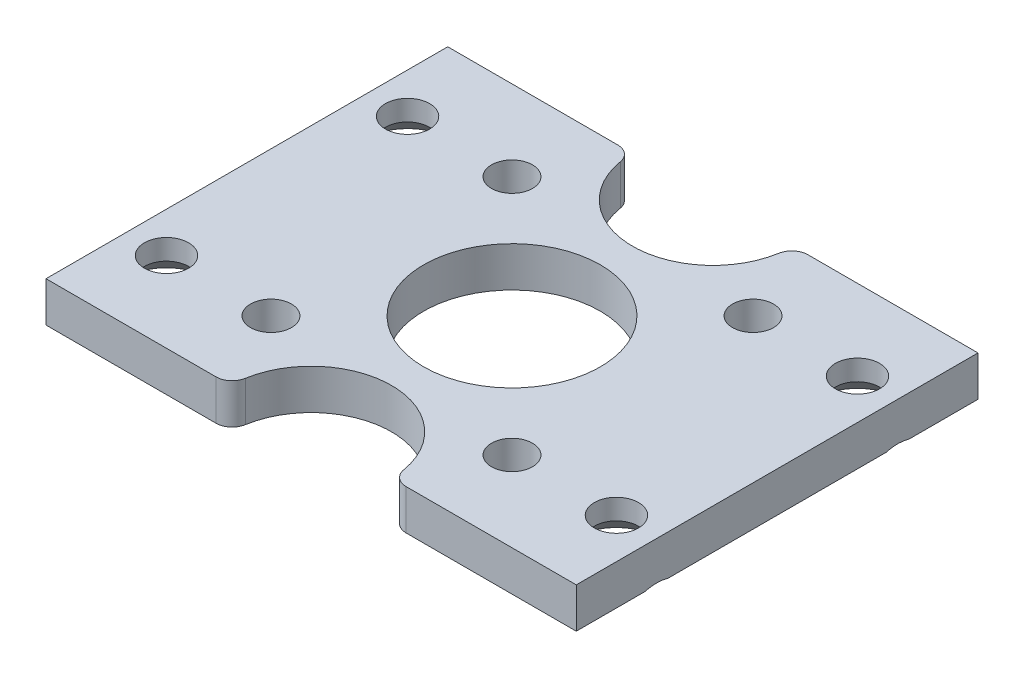
ISO-10303-21;
HEADER;
FILE_DESCRIPTION(('STEP AP214'),'2;1');
FILE_NAME('part.step','',(''),(''),'','','');
FILE_SCHEMA(('AUTOMOTIVE_DESIGN { 1 0 10303 214 1 1 1 1 }'));
ENDSEC;
DATA;
#1=APPLICATION_CONTEXT('core data for automotive mechanical design processes');
#2=APPLICATION_PROTOCOL_DEFINITION('international standard','automotive_design',2000,#1);
#3=PRODUCT_CONTEXT('',#1,'mechanical');
#4=PRODUCT('Part','Part','',(#3));
#5=PRODUCT_RELATED_PRODUCT_CATEGORY('part','',(#4));
#6=PRODUCT_DEFINITION_FORMATION('','',#4);
#7=PRODUCT_DEFINITION_CONTEXT('part definition',#1,'design');
#8=PRODUCT_DEFINITION('design','',#6,#7);
#9=PRODUCT_DEFINITION_SHAPE('','',#8);
#10=(LENGTH_UNIT() NAMED_UNIT(*) SI_UNIT(.MILLI.,.METRE.));
#11=(NAMED_UNIT(*) PLANE_ANGLE_UNIT() SI_UNIT($,.RADIAN.));
#12=(NAMED_UNIT(*) SI_UNIT($,.STERADIAN.) SOLID_ANGLE_UNIT());
#13=UNCERTAINTY_MEASURE_WITH_UNIT(LENGTH_MEASURE(1.E-05),#10,'distance_accuracy_value','');
#14=(GEOMETRIC_REPRESENTATION_CONTEXT(3) GLOBAL_UNCERTAINTY_ASSIGNED_CONTEXT((#13)) GLOBAL_UNIT_ASSIGNED_CONTEXT((#10,
#11,#12)) REPRESENTATION_CONTEXT('',''));
#15=CARTESIAN_POINT('',(0.,0.,0.));
#16=DIRECTION('',(0.,0.,1.));
#17=DIRECTION('',(1.,0.,0.));
#18=AXIS2_PLACEMENT_3D('',#15,#16,#17);
#19=CARTESIAN_POINT('',(21.1678404338007,0.,-48.));
#20=DIRECTION('',(0.,1.,0.));
#21=DIRECTION('',(0.,0.,1.));
#22=AXIS2_PLACEMENT_3D('',#19,#20,#21);
#23=PLANE('',#22);
#24=DIRECTION('',(0.,0.,1.));
#25=VECTOR('',#24,1.);
#26=CARTESIAN_POINT('',(65.9999999999999,0.,-50.));
#27=LINE('',#26,#25);
#28=CARTESIAN_POINT('',(65.9999999999999,3.96634505706077E-11,-38.5717143143521));
#29=VERTEX_POINT('',#28);
#30=CARTESIAN_POINT('',(65.9999999999999,2.8421709430404E-11,-11.4282856859947));
#31=VERTEX_POINT('',#30);
#32=EDGE_CURVE('E180',#29,#31,#27,.T.);
#33=ORIENTED_EDGE('',*,*,#32,.T.);
#34=CARTESIAN_POINT('',(61.,5.6843418860808E-11,-9.9999999999997));
#35=DIRECTION('',(0.,-1.,0.));
#36=DIRECTION('',(0.,0.,-1.));
#37=AXIS2_PLACEMENT_3D('',#34,#35,#36);
#38=CIRCLE('',#37,5.20000000005014);
#39=CARTESIAN_POINT('',(65.9999999999999,7.82082863757657E-11,-8.57171431418595));
#40=VERTEX_POINT('',#39);
#41=EDGE_CURVE('E453',#31,#40,#38,.F.);
#42=ORIENTED_EDGE('',*,*,#41,.T.);
#43=DIRECTION('',(0.,0.,1.));
#44=VECTOR('',#43,1.);
#45=CARTESIAN_POINT('',(65.9999999999999,0.,-50.));
#46=LINE('',#45,#44);
#47=CARTESIAN_POINT('',(65.9999999999999,0.,0.));
#48=VERTEX_POINT('',#47);
#49=EDGE_CURVE('E198',#40,#48,#46,.T.);
#50=ORIENTED_EDGE('',*,*,#49,.T.);
#51=DIRECTION('',(-1.,0.,0.));
#52=VECTOR('',#51,1.);
#53=CARTESIAN_POINT('',(65.9999999999999,0.,0.));
#54=LINE('',#53,#52);
#55=CARTESIAN_POINT('',(44.8321595661992,0.,0.));
#56=VERTEX_POINT('',#55);
#57=EDGE_CURVE('E208',#48,#56,#54,.T.);
#58=ORIENTED_EDGE('',*,*,#57,.T.);
#59=CARTESIAN_POINT('',(44.8321595661992,0.,-2.));
#60=DIRECTION('',(0.,-1.,0.));
#61=DIRECTION('',(0.,0.,-1.));
#62=AXIS2_PLACEMENT_3D('',#59,#60,#61);
#63=CIRCLE('',#62,2.);
#64=CARTESIAN_POINT('',(42.8601329718326,0.,-1.66666666666667));
#65=VERTEX_POINT('',#64);
#66=EDGE_CURVE('E212',#65,#56,#63,.F.);
#67=ORIENTED_EDGE('',*,*,#66,.F.);
#68=CARTESIAN_POINT('',(32.9999999999999,0.,0.));
#69=DIRECTION('',(0.,-1.,0.));
#70=DIRECTION('',(0.,0.,-1.));
#71=AXIS2_PLACEMENT_3D('',#68,#69,#70);
#72=CIRCLE('',#71,10.);
#73=CARTESIAN_POINT('',(23.1398670281672,0.,-1.66666666666666));
#74=VERTEX_POINT('',#73);
#75=EDGE_CURVE('E215',#65,#74,#72,.F.);
#76=ORIENTED_EDGE('',*,*,#75,.T.);
#77=CARTESIAN_POINT('',(21.1678404338007,0.,-2.));
#78=DIRECTION('',(0.,-1.,0.));
#79=DIRECTION('',(0.,0.,-1.));
#80=AXIS2_PLACEMENT_3D('',#77,#78,#79);
#81=CIRCLE('',#80,2.);
#82=CARTESIAN_POINT('',(21.1678404338007,0.,0.));
#83=VERTEX_POINT('',#82);
#84=EDGE_CURVE('E219',#83,#74,#81,.F.);
#85=ORIENTED_EDGE('',*,*,#84,.F.);
#86=DIRECTION('',(-1.,0.,0.));
#87=VECTOR('',#86,1.);
#88=CARTESIAN_POINT('',(21.1678404338007,0.,0.));
#89=LINE('',#88,#87);
#90=CARTESIAN_POINT('',(0.,0.,0.));
#91=VERTEX_POINT('',#90);
#92=EDGE_CURVE('E239',#83,#91,#89,.T.);
#93=ORIENTED_EDGE('',*,*,#92,.T.);
#94=DIRECTION('',(0.,0.,-1.));
#95=VECTOR('',#94,1.);
#96=CARTESIAN_POINT('',(0.,0.,0.));
#97=LINE('',#96,#95);
#98=CARTESIAN_POINT('',(0.,2.8421709430404E-11,-8.571714314419));
#99=VERTEX_POINT('',#98);
#100=EDGE_CURVE('E222',#91,#99,#97,.T.);
#101=ORIENTED_EDGE('',*,*,#100,.T.);
#102=CARTESIAN_POINT('',(5.,5.6843418860808E-11,-9.9999999999997));
#103=DIRECTION('',(0.,-1.,0.));
#104=DIRECTION('',(0.,0.,-1.));
#105=AXIS2_PLACEMENT_3D('',#102,#103,#104);
#106=CIRCLE('',#105,5.19999999993646);
#107=CARTESIAN_POINT('',(0.,2.61513762574153E-11,-11.4282856855887));
#108=VERTEX_POINT('',#107);
#109=EDGE_CURVE('E137',#99,#108,#106,.F.);
#110=ORIENTED_EDGE('',*,*,#109,.T.);
#111=DIRECTION('',(0.,0.,-1.));
#112=VECTOR('',#111,1.);
#113=CARTESIAN_POINT('',(0.,0.,0.));
#114=LINE('',#113,#112);
#115=CARTESIAN_POINT('',(0.,0.,-38.5717143144151));
#116=VERTEX_POINT('',#115);
#117=EDGE_CURVE('E135',#108,#116,#114,.T.);
#118=ORIENTED_EDGE('',*,*,#117,.T.);
#119=CARTESIAN_POINT('',(5.,0.,-39.9999999999997));
#120=DIRECTION('',(0.,-1.,0.));
#121=DIRECTION('',(0.,0.,-1.));
#122=AXIS2_PLACEMENT_3D('',#119,#120,#121);
#123=CIRCLE('',#122,5.19999999996597);
#124=CARTESIAN_POINT('',(0.,-1.55842576043141E-11,-41.4282856856411));
#125=VERTEX_POINT('',#124);
#126=EDGE_CURVE('E20',#116,#125,#123,.F.);
#127=ORIENTED_EDGE('',*,*,#126,.T.);
#128=DIRECTION('',(0.,0.,-1.));
#129=VECTOR('',#128,1.);
#130=CARTESIAN_POINT('',(0.,0.,0.));
#131=LINE('',#130,#129);
#132=CARTESIAN_POINT('',(0.,0.,-50.));
#133=VERTEX_POINT('',#132);
#134=EDGE_CURVE('E133',#125,#133,#131,.T.);
#135=ORIENTED_EDGE('',*,*,#134,.T.);
#136=DIRECTION('',(1.,0.,0.));
#137=VECTOR('',#136,1.);
#138=CARTESIAN_POINT('',(0.,0.,-50.));
#139=LINE('',#138,#137);
#140=CARTESIAN_POINT('',(21.1678404338007,0.,-50.));
#141=VERTEX_POINT('',#140);
#142=EDGE_CURVE('E142',#133,#141,#139,.T.);
#143=ORIENTED_EDGE('',*,*,#142,.T.);
#144=CARTESIAN_POINT('',(21.1678404338007,0.,-48.));
#145=DIRECTION('',(0.,-1.,0.));
#146=DIRECTION('',(0.,0.,-1.));
#147=AXIS2_PLACEMENT_3D('',#144,#145,#146);
#148=CIRCLE('',#147,2.);
#149=CARTESIAN_POINT('',(23.1398670281672,0.,-48.3333333333333));
#150=VERTEX_POINT('',#149);
#151=EDGE_CURVE('E169',#150,#141,#148,.F.);
#152=ORIENTED_EDGE('',*,*,#151,.F.);
#153=CARTESIAN_POINT('',(32.9999999999999,0.,-50.));
#154=DIRECTION('',(0.,-1.,0.));
#155=DIRECTION('',(0.,0.,-1.));
#156=AXIS2_PLACEMENT_3D('',#153,#154,#155);
#157=CIRCLE('',#156,10.);
#158=CARTESIAN_POINT('',(42.8601329718326,0.,-48.3333333333333));
#159=VERTEX_POINT('',#158);
#160=EDGE_CURVE('E172',#150,#159,#157,.F.);
#161=ORIENTED_EDGE('',*,*,#160,.T.);
#162=CARTESIAN_POINT('',(44.8321595661992,0.,-48.));
#163=DIRECTION('',(0.,-1.,0.));
#164=DIRECTION('',(0.,0.,-1.));
#165=AXIS2_PLACEMENT_3D('',#162,#163,#164);
#166=CIRCLE('',#165,2.);
#167=CARTESIAN_POINT('',(44.8321595661992,0.,-50.));
#168=VERTEX_POINT('',#167);
#169=EDGE_CURVE('E176',#168,#159,#166,.F.);
#170=ORIENTED_EDGE('',*,*,#169,.F.);
#171=DIRECTION('',(1.,0.,0.));
#172=VECTOR('',#171,1.);
#173=CARTESIAN_POINT('',(44.8321595661992,0.,-50.));
#174=LINE('',#173,#172);
#175=CARTESIAN_POINT('',(65.9999999999999,0.,-50.));
#176=VERTEX_POINT('',#175);
#177=EDGE_CURVE('E179',#168,#176,#174,.T.);
#178=ORIENTED_EDGE('',*,*,#177,.T.);
#179=DIRECTION('',(0.,0.,1.));
#180=VECTOR('',#179,1.);
#181=CARTESIAN_POINT('',(65.9999999999999,0.,-50.));
#182=LINE('',#181,#180);
#183=CARTESIAN_POINT('',(65.9999999999999,2.8421709430404E-11,-41.4282856856883));
#184=VERTEX_POINT('',#183);
#185=EDGE_CURVE('E192',#176,#184,#182,.T.);
#186=ORIENTED_EDGE('',*,*,#185,.T.);
#187=CARTESIAN_POINT('',(61.,5.6843418860808E-11,-39.9999999999997));
#188=DIRECTION('',(0.,-1.,0.));
#189=DIRECTION('',(0.,0.,-1.));
#190=AXIS2_PLACEMENT_3D('',#187,#188,#189);
#191=CIRCLE('',#190,5.19999999996597);
#192=EDGE_CURVE('E448',#184,#29,#191,.F.);
#193=ORIENTED_EDGE('',*,*,#192,.T.);
#194=EDGE_LOOP('',(#33,#42,#50,#58,#67,#76,#85,#93,#101,#110,#118,#127,#135,#143,#152,#161,#170,
#178,#186,#193));
#195=FACE_BOUND('',#194,.T.);
#196=CARTESIAN_POINT('',(18.,0.,-39.9999999999996));
#197=DIRECTION('',(0.,-1.,0.));
#198=DIRECTION('',(0.,0.,-1.));
#199=AXIS2_PLACEMENT_3D('',#196,#197,#198);
#200=CIRCLE('',#199,2.55000000000001);
#201=CARTESIAN_POINT('',(18.,0.,-42.5499999999997));
#202=VERTEX_POINT('',#201);
#203=EDGE_CURVE('E238',#202,#202,#200,.F.);
#204=ORIENTED_EDGE('',*,*,#203,.T.);
#205=EDGE_LOOP('',(#204));
#206=FACE_BOUND('',#205,.T.);
#207=CARTESIAN_POINT('',(18.0000000000003,0.,-9.9999999999997));
#208=DIRECTION('',(0.,-1.,0.));
#209=DIRECTION('',(0.,0.,-1.));
#210=AXIS2_PLACEMENT_3D('',#207,#208,#209);
#211=CIRCLE('',#210,2.55);
#212=CARTESIAN_POINT('',(18.0000000000003,0.,-12.5499999999997));
#213=VERTEX_POINT('',#212);
#214=EDGE_CURVE('E445',#213,#213,#211,.F.);
#215=ORIENTED_EDGE('',*,*,#214,.T.);
#216=EDGE_LOOP('',(#215));
#217=FACE_BOUND('',#216,.T.);
#218=CARTESIAN_POINT('',(48.0000000000003,0.,-9.99999999999995));
#219=DIRECTION('',(0.,-1.,0.));
#220=DIRECTION('',(0.,0.,-1.));
#221=AXIS2_PLACEMENT_3D('',#218,#219,#220);
#222=CIRCLE('',#221,2.55000000000001);
#223=CARTESIAN_POINT('',(48.0000000000003,0.,-12.55));
#224=VERTEX_POINT('',#223);
#225=EDGE_CURVE('E296',#224,#224,#222,.F.);
#226=ORIENTED_EDGE('',*,*,#225,.T.);
#227=EDGE_LOOP('',(#226));
#228=FACE_BOUND('',#227,.T.);
#229=CARTESIAN_POINT('',(48.,0.,-40.));
#230=DIRECTION('',(0.,-1.,0.));
#231=DIRECTION('',(0.,0.,-1.));
#232=AXIS2_PLACEMENT_3D('',#229,#230,#231);
#233=CIRCLE('',#232,2.55);
#234=CARTESIAN_POINT('',(48.,0.,-42.55));
#235=VERTEX_POINT('',#234);
#236=EDGE_CURVE('E299',#235,#235,#233,.F.);
#237=ORIENTED_EDGE('',*,*,#236,.T.);
#238=EDGE_LOOP('',(#237));
#239=FACE_BOUND('',#238,.T.);
#240=CARTESIAN_POINT('',(33.,0.,-25.));
#241=DIRECTION('',(0.,-1.,0.));
#242=DIRECTION('',(0.,0.,-1.));
#243=AXIS2_PLACEMENT_3D('',#240,#241,#242);
#244=CIRCLE('',#243,11.);
#245=CARTESIAN_POINT('',(33.,0.,-36.));
#246=VERTEX_POINT('',#245);
#247=EDGE_CURVE('E241',#246,#246,#244,.F.);
#248=ORIENTED_EDGE('',*,*,#247,.T.);
#249=EDGE_LOOP('',(#248));
#250=FACE_BOUND('',#249,.T.);
#251=ADVANCED_FACE('F17',(#195,#206,#217,#228,#239,#250),#23,.F.);
#252=CARTESIAN_POINT('',(5.,5.6843418860808E-11,-39.9999999999997));
#253=DIRECTION('',(0.,-1.,0.));
#254=DIRECTION('',(0.,0.,-1.));
#255=AXIS2_PLACEMENT_3D('',#252,#253,#254);
#256=CONICAL_SURFACE('',#255,5.19999999990912,0.785398163409049);
#257=CARTESIAN_POINT('',(-2.31003431271346E-12,-3.01943643072789E-11,-38.5717143143013));
#258=CARTESIAN_POINT('',(-8.29210870399365E-13,0.0344170494163364,-38.6968747104174));
#259=CARTESIAN_POINT('',(-2.22114735436354E-13,0.0648946941512553,-38.8231765382408));
#260=CARTESIAN_POINT('',(2.2229796237281E-13,0.117157335175448,-39.0776663491837));
#261=CARTESIAN_POINT('',(0.,0.138935141172088,-39.2058558020551));
#262=CARTESIAN_POINT('',(0.,0.172580706487008,-39.460908156976));
#263=CARTESIAN_POINT('',(0.,0.1846401490079,-39.5877453838048));
#264=CARTESIAN_POINT('',(0.,0.199108885863518,-39.8419183899519));
#265=CARTESIAN_POINT('',(0.,0.201522625801572,-39.969253912517));
#266=CARTESIAN_POINT('',(0.,0.19691939801584,-40.2079658363529));
#267=CARTESIAN_POINT('',(0.,0.191033315403374,-40.3193657461726));
#268=CARTESIAN_POINT('',(0.,0.171974653849719,-40.5415692257831));
#269=CARTESIAN_POINT('',(0.,0.158800082682143,-40.6523726241591));
#270=CARTESIAN_POINT('',(0.,0.125240753198249,-40.8749234771666));
#271=CARTESIAN_POINT('',(0.,0.104729645002339,-40.9866516452322));
#272=CARTESIAN_POINT('',(0.,0.0571416993100995,-41.2086338274996));
#273=CARTESIAN_POINT('',(0.,0.0300689212625509,-41.3188887088393));
#274=CARTESIAN_POINT('',(0.,-3.1235082345902E-11,-41.4282856856981));
#275=B_SPLINE_CURVE_WITH_KNOTS('',3,(#257,#258,#259,#260,#261,#262,#263,#264,#265,#266,#267,
#268,#269,#270,#271,#272,#273,#274),.UNSPECIFIED.,.F.,.F.,(4,2,2,2,2,2,2,2,4),(0.,
0.389439518103853,0.779200239793316,1.16107111219591,1.54276596399903,1.87719154280777,
2.2117085782851,2.55228840163756,2.89265805698703),.UNSPECIFIED.);
#276=EDGE_CURVE('E138',#116,#125,#275,.T.);
#277=ORIENTED_EDGE('',*,*,#276,.T.);
#278=ORIENTED_EDGE('',*,*,#126,.F.);
#279=EDGE_LOOP('',(#277,#278));
#280=FACE_BOUND('',#279,.T.);
#281=CARTESIAN_POINT('',(5.,2.45,-39.9999999999997));
#282=DIRECTION('',(0.,-1.,0.));
#283=DIRECTION('',(0.,0.,-1.));
#284=AXIS2_PLACEMENT_3D('',#281,#282,#283);
#285=CIRCLE('',#284,2.75);
#286=CARTESIAN_POINT('',(5.,2.45,-42.7499999999997));
#287=VERTEX_POINT('',#286);
#288=EDGE_CURVE('E235',#287,#287,#285,.F.);
#289=ORIENTED_EDGE('',*,*,#288,.T.);
#290=EDGE_LOOP('',(#289));
#291=FACE_BOUND('',#290,.T.);
#292=ADVANCED_FACE('F139',(#280,#291),#256,.F.);
#293=CARTESIAN_POINT('',(5.,1.13686837721616E-10,-9.9999999999997));
#294=DIRECTION('',(0.,-1.,0.));
#295=DIRECTION('',(0.,0.,-1.));
#296=AXIS2_PLACEMENT_3D('',#293,#294,#295);
#297=CONICAL_SURFACE('',#296,5.19999999987961,0.785398163397448);
#298=CARTESIAN_POINT('',(5.0112168355957E-12,-6.64965773384786E-12,-8.57171431429957));
#299=CARTESIAN_POINT('',(1.79882842588053E-12,0.0344170494429107,-8.6968747104158));
#300=CARTESIAN_POINT('',(4.8183918344012E-13,0.0648946941795646,-8.82317653823974));
#301=CARTESIAN_POINT('',(-4.82236666301423E-13,0.117157335205895,-9.077666349184));
#302=CARTESIAN_POINT('',(-1.27945068282997E-13,0.138935141202938,-9.20585580205629));
#303=CARTESIAN_POINT('',(1.25355144194032E-13,0.172580706518575,-9.46090815697866));
#304=CARTESIAN_POINT('',(0.,0.184640149039793,-9.58774538380819));
#305=CARTESIAN_POINT('',(0.,0.19910888589566,-9.84191838995658));
#306=CARTESIAN_POINT('',(0.,0.201522625833636,-9.96925391252244));
#307=CARTESIAN_POINT('',(0.,0.196919398047486,-10.2079658363587));
#308=CARTESIAN_POINT('',(0.,0.191033315434779,-10.319365746178));
#309=CARTESIAN_POINT('',(0.,0.171974653880524,-10.5415692257878));
#310=CARTESIAN_POINT('',(0.,0.158800082712588,-10.6523726241634));
#311=CARTESIAN_POINT('',(0.,0.125240753227856,-10.8749234771702));
#312=CARTESIAN_POINT('',(0.,0.104729645031457,-10.9866516452354));
#313=CARTESIAN_POINT('',(0.,0.0571416993381451,-11.2086338275021));
#314=CARTESIAN_POINT('',(0.,0.0300689212900127,-11.3188887088415));
#315=CARTESIAN_POINT('',(0.,-4.39369954245266E-12,-11.4282856856999));
#316=B_SPLINE_CURVE_WITH_KNOTS('',3,(#298,#299,#300,#301,#302,#303,#304,#305,#306,#307,#308,
#309,#310,#311,#312,#313,#314,#315),.UNSPECIFIED.,.F.,.F.,(4,2,2,2,2,2,2,2,4),(0.,
0.389439518106597,0.77920023979872,1.1610711122034,1.5427659640086,1.87719154281631,
2.21170857829258,2.55228840164433,2.8926580569931),.UNSPECIFIED.);
#317=EDGE_CURVE('E302',#99,#108,#316,.T.);
#318=ORIENTED_EDGE('',*,*,#317,.T.);
#319=ORIENTED_EDGE('',*,*,#109,.F.);
#320=EDGE_LOOP('',(#318,#319));
#321=FACE_BOUND('',#320,.T.);
#322=CARTESIAN_POINT('',(5.,2.45,-9.9999999999997));
#323=DIRECTION('',(0.,-1.,0.));
#324=DIRECTION('',(0.,0.,-1.));
#325=AXIS2_PLACEMENT_3D('',#322,#323,#324);
#326=CIRCLE('',#325,2.75);
#327=CARTESIAN_POINT('',(5.,2.45,-12.7499999999997));
#328=VERTEX_POINT('',#327);
#329=EDGE_CURVE('E232',#328,#328,#326,.F.);
#330=ORIENTED_EDGE('',*,*,#329,.T.);
#331=EDGE_LOOP('',(#330));
#332=FACE_BOUND('',#331,.T.);
#333=ADVANCED_FACE('F313',(#321,#332),#297,.F.);
#334=CARTESIAN_POINT('',(61.,5.6843418860808E-11,-9.9999999999997));
#335=DIRECTION('',(0.,-1.,0.));
#336=DIRECTION('',(0.,0.,-1.));
#337=AXIS2_PLACEMENT_3D('',#334,#335,#336);
#338=CONICAL_SURFACE('',#337,5.20000000005014,0.785398163409049);
#339=ORIENTED_EDGE('',*,*,#41,.F.);
#340=CARTESIAN_POINT('',(65.9999999999872,9.42130410881261E-11,-11.4282856857342));
#341=CARTESIAN_POINT('',(65.9999999999953,0.0344170495457532,-11.3031252896188));
#342=CARTESIAN_POINT('',(65.9999999999986,0.0648946942832873,-11.1768234617955));
#343=CARTESIAN_POINT('',(66.0000000000011,0.117157335310584,-10.9223336508523));
#344=CARTESIAN_POINT('',(66.0000000000002,0.138935141307716,-10.7941441979805));
#345=CARTESIAN_POINT('',(65.9999999999996,0.172580706624159,-10.5390918430591));
#346=CARTESIAN_POINT('',(65.9999999999998,0.184640149146081,-10.4122546162301));
#347=CARTESIAN_POINT('',(66.,0.199108886003595,-10.1580816100826));
#348=CARTESIAN_POINT('',(65.9999999999999,0.201522625942512,-10.0307460875171));
#349=CARTESIAN_POINT('',(65.9999999999999,0.196919398158278,-9.79203416367506));
#350=CARTESIAN_POINT('',(65.9999999999999,0.191033315546075,-9.6806342538495));
#351=CARTESIAN_POINT('',(65.9999999999999,0.17197465399216,-9.45843077422729));
#352=CARTESIAN_POINT('',(65.9999999999999,0.158800082824061,-9.34762737584545));
#353=CARTESIAN_POINT('',(65.9999999999999,0.125240753338352,-9.12507652282612));
#354=CARTESIAN_POINT('',(65.9999999999999,0.104729645141124,-9.01334835475453));
#355=CARTESIAN_POINT('',(65.9999999999999,0.057141699445569,-8.79136617247527));
#356=CARTESIAN_POINT('',(65.9999999999999,0.0300689213960225,-8.68111129112966));
#357=CARTESIAN_POINT('',(65.9999999999999,9.99473052577509E-11,-8.5717143142651));
#358=B_SPLINE_CURVE_WITH_KNOTS('',3,(#340,#341,#342,#343,#344,#345,#346,#347,#348,#349,#350,
#351,#352,#353,#354,#355,#356,#357),.UNSPECIFIED.,.F.,.F.,(4,2,2,2,2,2,2,2,4),(0.,
0.389439518105404,0.779200239796211,1.16107111219966,1.5427659640037,1.87719154282994,
2.21170857832475,2.55228840169564,2.89265805706356),.UNSPECIFIED.);
#359=EDGE_CURVE('E200',#31,#40,#358,.T.);
#360=ORIENTED_EDGE('',*,*,#359,.T.);
#361=EDGE_LOOP('',(#339,#360));
#362=FACE_BOUND('',#361,.T.);
#363=CARTESIAN_POINT('',(61.,2.45,-9.9999999999997));
#364=DIRECTION('',(0.,-1.,0.));
#365=DIRECTION('',(0.,0.,-1.));
#366=AXIS2_PLACEMENT_3D('',#363,#364,#365);
#367=CIRCLE('',#366,2.75);
#368=CARTESIAN_POINT('',(61.,2.45,-12.7499999999997));
#369=VERTEX_POINT('',#368);
#370=EDGE_CURVE('E229',#369,#369,#367,.F.);
#371=ORIENTED_EDGE('',*,*,#370,.T.);
#372=EDGE_LOOP('',(#371));
#373=FACE_BOUND('',#372,.T.);
#374=ADVANCED_FACE('F363',(#362,#373),#338,.F.);
#375=CARTESIAN_POINT('',(61.,5.6843418860808E-11,-39.9999999999997));
#376=DIRECTION('',(0.,-1.,0.));
#377=DIRECTION('',(0.,0.,-1.));
#378=AXIS2_PLACEMENT_3D('',#375,#376,#377);
#379=CONICAL_SURFACE('',#378,5.19999999996597,0.785398163397448);
#380=ORIENTED_EDGE('',*,*,#192,.F.);
#381=CARTESIAN_POINT('',(65.9999999999999,2.2483110055043E-11,-41.4282856857099));
#382=CARTESIAN_POINT('',(65.9999999999999,0.0344170494708717,-41.3031252895934));
#383=CARTESIAN_POINT('',(65.9999999999999,0.0648946942071734,-41.1768234617694));
#384=CARTESIAN_POINT('',(65.9999999999999,0.117157335233539,-40.9223336508252));
#385=CARTESIAN_POINT('',(65.9999999999999,0.138935141230969,-40.7941441979529));
#386=CARTESIAN_POINT('',(65.9999999999999,0.172580706547198,-40.5390918430306));
#387=CARTESIAN_POINT('',(65.9999999999999,0.184640149068624,-40.4122546162011));
#388=CARTESIAN_POINT('',(65.9999999999999,0.19910888592496,-40.1580816100527));
#389=CARTESIAN_POINT('',(65.9999999999999,0.201522625863198,-40.0307460874868));
#390=CARTESIAN_POINT('',(65.9999999999999,0.196919398077489,-39.7920341636489));
#391=CARTESIAN_POINT('',(65.9999999999999,0.191033315464854,-39.6806342538279));
#392=CARTESIAN_POINT('',(65.9999999999999,0.171974653910525,-39.4584307742148));
#393=CARTESIAN_POINT('',(65.9999999999999,0.158800082742442,-39.3476273758375));
#394=CARTESIAN_POINT('',(65.9999999999999,0.125240753257201,-39.1250765228274));
#395=CARTESIAN_POINT('',(65.9999999999999,0.104729645060436,-39.0133483547605));
#396=CARTESIAN_POINT('',(65.9999999999999,0.0571416993662059,-38.7913661724906));
#397=CARTESIAN_POINT('',(65.9999999999999,0.0300689213175213,-38.6811112911496));
#398=CARTESIAN_POINT('',(65.9999999999999,2.248323270874E-11,-38.5717143142896));
#399=B_SPLINE_CURVE_WITH_KNOTS('',3,(#381,#382,#383,#384,#385,#386,#387,#388,#389,#390,#391,
#392,#393,#394,#395,#396,#397,#398),.UNSPECIFIED.,.F.,.F.,(4,2,2,2,2,2,2,2,4),(0.,
0.389439518106537,0.779200239798689,1.16107111220344,1.54276596400869,1.87719154282134,
2.21170857830259,2.55228840165946,2.89265805701332),.UNSPECIFIED.);
#400=EDGE_CURVE('E191',#184,#29,#399,.T.);
#401=ORIENTED_EDGE('',*,*,#400,.T.);
#402=EDGE_LOOP('',(#380,#401));
#403=FACE_BOUND('',#402,.T.);
#404=CARTESIAN_POINT('',(61.,2.45,-39.9999999999997));
#405=DIRECTION('',(0.,-1.,0.));
#406=DIRECTION('',(0.,0.,-1.));
#407=AXIS2_PLACEMENT_3D('',#404,#405,#406);
#408=CIRCLE('',#407,2.75);
#409=CARTESIAN_POINT('',(61.,2.45,-42.7499999999997));
#410=VERTEX_POINT('',#409);
#411=EDGE_CURVE('E225',#410,#410,#408,.F.);
#412=ORIENTED_EDGE('',*,*,#411,.T.);
#413=EDGE_LOOP('',(#412));
#414=FACE_BOUND('',#413,.T.);
#415=ADVANCED_FACE('F366',(#403,#414),#379,.F.);
#416=CARTESIAN_POINT('',(18.0000000000003,5.,-9.9999999999997));
#417=DIRECTION('',(0.,-1.,0.));
#418=DIRECTION('',(0.,0.,-1.));
#419=AXIS2_PLACEMENT_3D('',#416,#417,#418);
#420=CYLINDRICAL_SURFACE('',#419,2.55);
#421=CARTESIAN_POINT('',(18.0000000000003,5.,-9.9999999999997));
#422=DIRECTION('',(0.,-1.,0.));
#423=DIRECTION('',(0.,0.,-1.));
#424=AXIS2_PLACEMENT_3D('',#421,#422,#423);
#425=CIRCLE('',#424,2.55);
#426=CARTESIAN_POINT('',(18.0000000000003,5.,-12.5499999999997));
#427=VERTEX_POINT('',#426);
#428=EDGE_CURVE('E228',#427,#427,#425,.T.);
#429=ORIENTED_EDGE('',*,*,#428,.F.);
#430=EDGE_LOOP('',(#429));
#431=FACE_BOUND('',#430,.T.);
#432=ORIENTED_EDGE('',*,*,#214,.F.);
#433=EDGE_LOOP('',(#432));
#434=FACE_BOUND('',#433,.T.);
#435=ADVANCED_FACE('F371',(#431,#434),#420,.F.);
#436=CARTESIAN_POINT('',(33.,5.,-25.));
#437=DIRECTION('',(0.,-1.,0.));
#438=DIRECTION('',(0.,0.,-1.));
#439=AXIS2_PLACEMENT_3D('',#436,#437,#438);
#440=CYLINDRICAL_SURFACE('',#439,11.);
#441=CARTESIAN_POINT('',(33.,5.,-25.));
#442=DIRECTION('',(0.,-1.,0.));
#443=DIRECTION('',(0.,0.,-1.));
#444=AXIS2_PLACEMENT_3D('',#441,#442,#443);
#445=CIRCLE('',#444,11.);
#446=CARTESIAN_POINT('',(33.,5.,-36.));
#447=VERTEX_POINT('',#446);
#448=EDGE_CURVE('E289',#447,#447,#445,.T.);
#449=ORIENTED_EDGE('',*,*,#448,.F.);
#450=EDGE_LOOP('',(#449));
#451=FACE_BOUND('',#450,.T.);
#452=ORIENTED_EDGE('',*,*,#247,.F.);
#453=EDGE_LOOP('',(#452));
#454=FACE_BOUND('',#453,.T.);
#455=ADVANCED_FACE('F375',(#451,#454),#440,.F.);
#456=CARTESIAN_POINT('',(21.1678404338007,5.,0.));
#457=DIRECTION('',(0.,0.,-1.));
#458=DIRECTION('',(-1.,0.,0.));
#459=AXIS2_PLACEMENT_3D('',#456,#457,#458);
#460=PLANE('',#459);
#461=DIRECTION('',(0.,-1.,0.));
#462=VECTOR('',#461,1.);
#463=CARTESIAN_POINT('',(21.1678404338007,5.,0.));
#464=LINE('',#463,#462);
#465=CARTESIAN_POINT('',(21.1678404338007,5.,0.));
#466=VERTEX_POINT('',#465);
#467=EDGE_CURVE('E216',#466,#83,#464,.T.);
#468=ORIENTED_EDGE('',*,*,#467,.F.);
#469=DIRECTION('',(1.,0.,0.));
#470=VECTOR('',#469,1.);
#471=CARTESIAN_POINT('',(21.1678404338007,5.,0.));
#472=LINE('',#471,#470);
#473=CARTESIAN_POINT('',(0.,5.,0.));
#474=VERTEX_POINT('',#473);
#475=EDGE_CURVE('E288',#474,#466,#472,.T.);
#476=ORIENTED_EDGE('',*,*,#475,.F.);
#477=DIRECTION('',(0.,1.,0.));
#478=VECTOR('',#477,1.);
#479=CARTESIAN_POINT('',(0.,5.,0.));
#480=LINE('',#479,#478);
#481=EDGE_CURVE('E147',#474,#91,#480,.F.);
#482=ORIENTED_EDGE('',*,*,#481,.T.);
#483=ORIENTED_EDGE('',*,*,#92,.F.);
#484=EDGE_LOOP('',(#468,#476,#482,#483));
#485=FACE_BOUND('',#484,.T.);
#486=ADVANCED_FACE('F379',(#485),#460,.F.);
#487=CARTESIAN_POINT('',(21.1678404338007,5.,-2.));
#488=DIRECTION('',(0.,-1.,0.));
#489=DIRECTION('',(0.,0.,-1.));
#490=AXIS2_PLACEMENT_3D('',#487,#488,#489);
#491=CYLINDRICAL_SURFACE('',#490,2.);
#492=CARTESIAN_POINT('',(21.1678404338007,5.,-2.));
#493=DIRECTION('',(0.,-1.,0.));
#494=DIRECTION('',(0.,0.,-1.));
#495=AXIS2_PLACEMENT_3D('',#492,#493,#494);
#496=CIRCLE('',#495,2.);
#497=CARTESIAN_POINT('',(23.1398670281672,5.,-1.66666666666666));
#498=VERTEX_POINT('',#497);
#499=EDGE_CURVE('E285',#466,#498,#496,.F.);
#500=ORIENTED_EDGE('',*,*,#499,.F.);
#501=ORIENTED_EDGE('',*,*,#467,.T.);
#502=ORIENTED_EDGE('',*,*,#84,.T.);
#503=DIRECTION('',(0.,-1.,0.));
#504=VECTOR('',#503,1.);
#505=CARTESIAN_POINT('',(23.1398670281672,5.,-1.66666666666666));
#506=LINE('',#505,#504);
#507=EDGE_CURVE('E213',#74,#498,#506,.F.);
#508=ORIENTED_EDGE('',*,*,#507,.T.);
#509=EDGE_LOOP('',(#500,#501,#502,#508));
#510=FACE_BOUND('',#509,.T.);
#511=ADVANCED_FACE('F383',(#510),#491,.T.);
#512=CARTESIAN_POINT('',(32.9999999999999,5.,0.));
#513=DIRECTION('',(0.,-1.,0.));
#514=DIRECTION('',(0.,0.,-1.));
#515=AXIS2_PLACEMENT_3D('',#512,#513,#514);
#516=CYLINDRICAL_SURFACE('',#515,10.);
#517=DIRECTION('',(0.,-1.,0.));
#518=VECTOR('',#517,1.);
#519=CARTESIAN_POINT('',(42.8601329718326,5.,-1.66666666666666));
#520=LINE('',#519,#518);
#521=CARTESIAN_POINT('',(42.8601329718326,5.,-1.66666666666667));
#522=VERTEX_POINT('',#521);
#523=EDGE_CURVE('E209',#522,#65,#520,.T.);
#524=ORIENTED_EDGE('',*,*,#523,.F.);
#525=CARTESIAN_POINT('',(32.9999999999999,5.,0.));
#526=DIRECTION('',(0.,-1.,0.));
#527=DIRECTION('',(0.,0.,-1.));
#528=AXIS2_PLACEMENT_3D('',#525,#526,#527);
#529=CIRCLE('',#528,10.);
#530=EDGE_CURVE('E283',#498,#522,#529,.T.);
#531=ORIENTED_EDGE('',*,*,#530,.F.);
#532=ORIENTED_EDGE('',*,*,#507,.F.);
#533=ORIENTED_EDGE('',*,*,#75,.F.);
#534=EDGE_LOOP('',(#524,#531,#532,#533));
#535=FACE_BOUND('',#534,.T.);
#536=ADVANCED_FACE('F387',(#535),#516,.F.);
#537=CARTESIAN_POINT('',(44.8321595661992,5.,-2.));
#538=DIRECTION('',(0.,-1.,0.));
#539=DIRECTION('',(0.,0.,-1.));
#540=AXIS2_PLACEMENT_3D('',#537,#538,#539);
#541=CYLINDRICAL_SURFACE('',#540,2.);
#542=CARTESIAN_POINT('',(44.8321595661992,5.,-2.));
#543=DIRECTION('',(0.,-1.,0.));
#544=DIRECTION('',(0.,0.,-1.));
#545=AXIS2_PLACEMENT_3D('',#542,#543,#544);
#546=CIRCLE('',#545,2.);
#547=CARTESIAN_POINT('',(44.8321595661992,5.,0.));
#548=VERTEX_POINT('',#547);
#549=EDGE_CURVE('E280',#522,#548,#546,.F.);
#550=ORIENTED_EDGE('',*,*,#549,.F.);
#551=ORIENTED_EDGE('',*,*,#523,.T.);
#552=ORIENTED_EDGE('',*,*,#66,.T.);
#553=DIRECTION('',(0.,1.,0.));
#554=VECTOR('',#553,1.);
#555=CARTESIAN_POINT('',(44.8321595661992,5.,0.));
#556=LINE('',#555,#554);
#557=EDGE_CURVE('E206',#56,#548,#556,.T.);
#558=ORIENTED_EDGE('',*,*,#557,.T.);
#559=EDGE_LOOP('',(#550,#551,#552,#558));
#560=FACE_BOUND('',#559,.T.);
#561=ADVANCED_FACE('F390',(#560),#541,.T.);
#562=CARTESIAN_POINT('',(65.9999999999999,5.,0.));
#563=DIRECTION('',(0.,0.,-1.));
#564=DIRECTION('',(-1.,0.,0.));
#565=AXIS2_PLACEMENT_3D('',#562,#563,#564);
#566=PLANE('',#565);
#567=DIRECTION('',(0.,1.,0.));
#568=VECTOR('',#567,1.);
#569=CARTESIAN_POINT('',(65.9999999999999,5.,0.));
#570=LINE('',#569,#568);
#571=CARTESIAN_POINT('',(65.9999999999999,5.,0.));
#572=VERTEX_POINT('',#571);
#573=EDGE_CURVE('E195',#48,#572,#570,.T.);
#574=ORIENTED_EDGE('',*,*,#573,.T.);
#575=DIRECTION('',(1.,0.,0.));
#576=VECTOR('',#575,1.);
#577=CARTESIAN_POINT('',(21.1678404338007,5.,0.));
#578=LINE('',#577,#576);
#579=EDGE_CURVE('E187',#548,#572,#578,.T.);
#580=ORIENTED_EDGE('',*,*,#579,.F.);
#581=ORIENTED_EDGE('',*,*,#557,.F.);
#582=ORIENTED_EDGE('',*,*,#57,.F.);
#583=EDGE_LOOP('',(#574,#580,#581,#582));
#584=FACE_BOUND('',#583,.T.);
#585=ADVANCED_FACE('F346',(#584),#566,.F.);
#586=CARTESIAN_POINT('',(65.9999999999999,5.,-50.));
#587=DIRECTION('',(-1.,0.,0.));
#588=DIRECTION('',(0.,0.,1.));
#589=AXIS2_PLACEMENT_3D('',#586,#587,#588);
#590=PLANE('',#589);
#591=ORIENTED_EDGE('',*,*,#400,.F.);
#592=ORIENTED_EDGE('',*,*,#185,.F.);
#593=DIRECTION('',(0.,1.,0.));
#594=VECTOR('',#593,1.);
#595=CARTESIAN_POINT('',(65.9999999999999,5.,-50.));
#596=LINE('',#595,#594);
#597=CARTESIAN_POINT('',(65.9999999999999,5.,-50.));
#598=VERTEX_POINT('',#597);
#599=EDGE_CURVE('E177',#176,#598,#596,.T.);
#600=ORIENTED_EDGE('',*,*,#599,.T.);
#601=DIRECTION('',(0.,0.,1.));
#602=VECTOR('',#601,1.);
#603=CARTESIAN_POINT('',(65.9999999999999,5.,-48.));
#604=LINE('',#603,#602);
#605=EDGE_CURVE('E183',#572,#598,#604,.F.);
#606=ORIENTED_EDGE('',*,*,#605,.F.);
#607=ORIENTED_EDGE('',*,*,#573,.F.);
#608=ORIENTED_EDGE('',*,*,#49,.F.);
#609=ORIENTED_EDGE('',*,*,#359,.F.);
#610=ORIENTED_EDGE('',*,*,#32,.F.);
#611=EDGE_LOOP('',(#591,#592,#600,#606,#607,#608,#609,#610));
#612=FACE_BOUND('',#611,.T.);
#613=ADVANCED_FACE('F341',(#612),#590,.F.);
#614=CARTESIAN_POINT('',(44.8321595661992,5.,-50.));
#615=DIRECTION('',(0.,0.,1.));
#616=DIRECTION('',(1.,0.,0.));
#617=AXIS2_PLACEMENT_3D('',#614,#615,#616);
#618=PLANE('',#617);
#619=DIRECTION('',(0.,-1.,0.));
#620=VECTOR('',#619,1.);
#621=CARTESIAN_POINT('',(44.8321595661992,5.,-50.));
#622=LINE('',#621,#620);
#623=CARTESIAN_POINT('',(44.8321595661992,5.,-50.));
#624=VERTEX_POINT('',#623);
#625=EDGE_CURVE('E173',#624,#168,#622,.T.);
#626=ORIENTED_EDGE('',*,*,#625,.F.);
#627=DIRECTION('',(1.,0.,0.));
#628=VECTOR('',#627,1.);
#629=CARTESIAN_POINT('',(21.1678404338007,5.,-50.));
#630=LINE('',#629,#628);
#631=EDGE_CURVE('E186',#598,#624,#630,.F.);
#632=ORIENTED_EDGE('',*,*,#631,.F.);
#633=ORIENTED_EDGE('',*,*,#599,.F.);
#634=ORIENTED_EDGE('',*,*,#177,.F.);
#635=EDGE_LOOP('',(#626,#632,#633,#634));
#636=FACE_BOUND('',#635,.T.);
#637=ADVANCED_FACE('F337',(#636),#618,.F.);
#638=CARTESIAN_POINT('',(44.8321595661992,5.,-48.));
#639=DIRECTION('',(0.,-1.,0.));
#640=DIRECTION('',(0.,0.,-1.));
#641=AXIS2_PLACEMENT_3D('',#638,#639,#640);
#642=CYLINDRICAL_SURFACE('',#641,2.);
#643=CARTESIAN_POINT('',(44.8321595661992,5.,-48.));
#644=DIRECTION('',(0.,-1.,0.));
#645=DIRECTION('',(0.,0.,-1.));
#646=AXIS2_PLACEMENT_3D('',#643,#644,#645);
#647=CIRCLE('',#646,2.);
#648=CARTESIAN_POINT('',(42.8601329718326,5.,-48.3333333333333));
#649=VERTEX_POINT('',#648);
#650=EDGE_CURVE('E277',#624,#649,#647,.F.);
#651=ORIENTED_EDGE('',*,*,#650,.F.);
#652=ORIENTED_EDGE('',*,*,#625,.T.);
#653=ORIENTED_EDGE('',*,*,#169,.T.);
#654=DIRECTION('',(0.,-1.,0.));
#655=VECTOR('',#654,1.);
#656=CARTESIAN_POINT('',(42.8601329718326,5.,-48.3333333333333));
#657=LINE('',#656,#655);
#658=EDGE_CURVE('E170',#159,#649,#657,.F.);
#659=ORIENTED_EDGE('',*,*,#658,.T.);
#660=EDGE_LOOP('',(#651,#652,#653,#659));
#661=FACE_BOUND('',#660,.T.);
#662=ADVANCED_FACE('F333',(#661),#642,.T.);
#663=CARTESIAN_POINT('',(32.9999999999999,5.,-50.));
#664=DIRECTION('',(0.,-1.,0.));
#665=DIRECTION('',(0.,0.,-1.));
#666=AXIS2_PLACEMENT_3D('',#663,#664,#665);
#667=CYLINDRICAL_SURFACE('',#666,10.);
#668=DIRECTION('',(0.,-1.,0.));
#669=VECTOR('',#668,1.);
#670=CARTESIAN_POINT('',(23.1398670281672,5.,-48.3333333333333));
#671=LINE('',#670,#669);
#672=CARTESIAN_POINT('',(23.1398670281672,5.,-48.3333333333333));
#673=VERTEX_POINT('',#672);
#674=EDGE_CURVE('E157',#673,#150,#671,.T.);
#675=ORIENTED_EDGE('',*,*,#674,.F.);
#676=CARTESIAN_POINT('',(32.9999999999999,5.,-50.));
#677=DIRECTION('',(0.,-1.,0.));
#678=DIRECTION('',(0.,0.,-1.));
#679=AXIS2_PLACEMENT_3D('',#676,#677,#678);
#680=CIRCLE('',#679,10.);
#681=EDGE_CURVE('E274',#649,#673,#680,.T.);
#682=ORIENTED_EDGE('',*,*,#681,.F.);
#683=ORIENTED_EDGE('',*,*,#658,.F.);
#684=ORIENTED_EDGE('',*,*,#160,.F.);
#685=EDGE_LOOP('',(#675,#682,#683,#684));
#686=FACE_BOUND('',#685,.T.);
#687=ADVANCED_FACE('F329',(#686),#667,.F.);
#688=CARTESIAN_POINT('',(21.1678404338007,5.,-48.));
#689=DIRECTION('',(0.,-1.,0.));
#690=DIRECTION('',(0.,0.,-1.));
#691=AXIS2_PLACEMENT_3D('',#688,#689,#690);
#692=CYLINDRICAL_SURFACE('',#691,2.);
#693=CARTESIAN_POINT('',(21.1678404338007,5.,-48.));
#694=DIRECTION('',(0.,-1.,0.));
#695=DIRECTION('',(0.,0.,-1.));
#696=AXIS2_PLACEMENT_3D('',#693,#694,#695);
#697=CIRCLE('',#696,2.);
#698=CARTESIAN_POINT('',(21.1678404338007,5.,-50.));
#699=VERTEX_POINT('',#698);
#700=EDGE_CURVE('E271',#673,#699,#697,.F.);
#701=ORIENTED_EDGE('',*,*,#700,.F.);
#702=ORIENTED_EDGE('',*,*,#674,.T.);
#703=ORIENTED_EDGE('',*,*,#151,.T.);
#704=DIRECTION('',(0.,1.,0.));
#705=VECTOR('',#704,1.);
#706=CARTESIAN_POINT('',(21.1678404338007,5.,-50.));
#707=LINE('',#706,#705);
#708=EDGE_CURVE('E155',#141,#699,#707,.T.);
#709=ORIENTED_EDGE('',*,*,#708,.T.);
#710=EDGE_LOOP('',(#701,#702,#703,#709));
#711=FACE_BOUND('',#710,.T.);
#712=ADVANCED_FACE('F326',(#711),#692,.T.);
#713=CARTESIAN_POINT('',(0.,5.,-50.));
#714=DIRECTION('',(0.,0.,1.));
#715=DIRECTION('',(1.,0.,0.));
#716=AXIS2_PLACEMENT_3D('',#713,#714,#715);
#717=PLANE('',#716);
#718=DIRECTION('',(0.,1.,0.));
#719=VECTOR('',#718,1.);
#720=CARTESIAN_POINT('',(0.,5.,-50.));
#721=LINE('',#720,#719);
#722=CARTESIAN_POINT('',(0.,5.,-50.));
#723=VERTEX_POINT('',#722);
#724=EDGE_CURVE('E35',#133,#723,#721,.T.);
#725=ORIENTED_EDGE('',*,*,#724,.T.);
#726=DIRECTION('',(1.,0.,0.));
#727=VECTOR('',#726,1.);
#728=CARTESIAN_POINT('',(21.1678404338007,5.,-50.));
#729=LINE('',#728,#727);
#730=EDGE_CURVE('E162',#699,#723,#729,.F.);
#731=ORIENTED_EDGE('',*,*,#730,.F.);
#732=ORIENTED_EDGE('',*,*,#708,.F.);
#733=ORIENTED_EDGE('',*,*,#142,.F.);
#734=EDGE_LOOP('',(#725,#731,#732,#733));
#735=FACE_BOUND('',#734,.T.);
#736=ADVANCED_FACE('F321',(#735),#717,.F.);
#737=CARTESIAN_POINT('',(0.,5.,0.));
#738=DIRECTION('',(1.,0.,0.));
#739=DIRECTION('',(0.,0.,-1.));
#740=AXIS2_PLACEMENT_3D('',#737,#738,#739);
#741=PLANE('',#740);
#742=ORIENTED_EDGE('',*,*,#317,.F.);
#743=ORIENTED_EDGE('',*,*,#100,.F.);
#744=ORIENTED_EDGE('',*,*,#481,.F.);
#745=DIRECTION('',(0.,0.,1.));
#746=VECTOR('',#745,1.);
#747=CARTESIAN_POINT('',(0.,5.,-48.));
#748=LINE('',#747,#746);
#749=EDGE_CURVE('E158',#723,#474,#748,.T.);
#750=ORIENTED_EDGE('',*,*,#749,.F.);
#751=ORIENTED_EDGE('',*,*,#724,.F.);
#752=ORIENTED_EDGE('',*,*,#134,.F.);
#753=ORIENTED_EDGE('',*,*,#276,.F.);
#754=ORIENTED_EDGE('',*,*,#117,.F.);
#755=EDGE_LOOP('',(#742,#743,#744,#750,#751,#752,#753,#754));
#756=FACE_BOUND('',#755,.T.);
#757=ADVANCED_FACE('F145',(#756),#741,.F.);
#758=CARTESIAN_POINT('',(48.,5.,-40.));
#759=DIRECTION('',(0.,-1.,0.));
#760=DIRECTION('',(0.,0.,-1.));
#761=AXIS2_PLACEMENT_3D('',#758,#759,#760);
#762=CYLINDRICAL_SURFACE('',#761,2.55);
#763=CARTESIAN_POINT('',(48.,5.,-40.));
#764=DIRECTION('',(0.,-1.,0.));
#765=DIRECTION('',(0.,0.,-1.));
#766=AXIS2_PLACEMENT_3D('',#763,#764,#765);
#767=CIRCLE('',#766,2.55);
#768=CARTESIAN_POINT('',(48.,5.,-42.55));
#769=VERTEX_POINT('',#768);
#770=EDGE_CURVE('E161',#769,#769,#767,.T.);
#771=ORIENTED_EDGE('',*,*,#770,.F.);
#772=EDGE_LOOP('',(#771));
#773=FACE_BOUND('',#772,.T.);
#774=ORIENTED_EDGE('',*,*,#236,.F.);
#775=EDGE_LOOP('',(#774));
#776=FACE_BOUND('',#775,.T.);
#777=ADVANCED_FACE('F320',(#773,#776),#762,.F.);
#778=CARTESIAN_POINT('',(48.0000000000003,5.,-9.99999999999995));
#779=DIRECTION('',(0.,-1.,0.));
#780=DIRECTION('',(0.,0.,-1.));
#781=AXIS2_PLACEMENT_3D('',#778,#779,#780);
#782=CYLINDRICAL_SURFACE('',#781,2.55000000000001);
#783=CARTESIAN_POINT('',(48.0000000000003,5.,-9.99999999999995));
#784=DIRECTION('',(0.,-1.,0.));
#785=DIRECTION('',(0.,0.,-1.));
#786=AXIS2_PLACEMENT_3D('',#783,#784,#785);
#787=CIRCLE('',#786,2.55000000000001);
#788=CARTESIAN_POINT('',(48.0000000000003,5.,-12.55));
#789=VERTEX_POINT('',#788);
#790=EDGE_CURVE('E266',#789,#789,#787,.T.);
#791=ORIENTED_EDGE('',*,*,#790,.F.);
#792=EDGE_LOOP('',(#791));
#793=FACE_BOUND('',#792,.T.);
#794=ORIENTED_EDGE('',*,*,#225,.F.);
#795=EDGE_LOOP('',(#794));
#796=FACE_BOUND('',#795,.T.);
#797=ADVANCED_FACE('F426',(#793,#796),#782,.F.);
#798=CARTESIAN_POINT('',(18.,5.,-39.9999999999996));
#799=DIRECTION('',(0.,-1.,0.));
#800=DIRECTION('',(0.,0.,-1.));
#801=AXIS2_PLACEMENT_3D('',#798,#799,#800);
#802=CYLINDRICAL_SURFACE('',#801,2.55000000000001);
#803=CARTESIAN_POINT('',(18.,5.,-39.9999999999996));
#804=DIRECTION('',(0.,-1.,0.));
#805=DIRECTION('',(0.,0.,-1.));
#806=AXIS2_PLACEMENT_3D('',#803,#804,#805);
#807=CIRCLE('',#806,2.55000000000001);
#808=CARTESIAN_POINT('',(18.,5.,-42.5499999999997));
#809=VERTEX_POINT('',#808);
#810=EDGE_CURVE('E263',#809,#809,#807,.T.);
#811=ORIENTED_EDGE('',*,*,#810,.F.);
#812=EDGE_LOOP('',(#811));
#813=FACE_BOUND('',#812,.T.);
#814=ORIENTED_EDGE('',*,*,#203,.F.);
#815=EDGE_LOOP('',(#814));
#816=FACE_BOUND('',#815,.T.);
#817=ADVANCED_FACE('F423',(#813,#816),#802,.F.);
#818=CARTESIAN_POINT('',(5.,0.,-39.9999999999997));
#819=DIRECTION('',(0.,-1.,0.));
#820=DIRECTION('',(0.,0.,-1.));
#821=AXIS2_PLACEMENT_3D('',#818,#819,#820);
#822=CYLINDRICAL_SURFACE('',#821,2.75);
#823=ORIENTED_EDGE('',*,*,#288,.F.);
#824=EDGE_LOOP('',(#823));
#825=FACE_BOUND('',#824,.T.);
#826=CARTESIAN_POINT('',(5.,5.,-39.9999999999997));
#827=DIRECTION('',(0.,-1.,0.));
#828=DIRECTION('',(0.,0.,-1.));
#829=AXIS2_PLACEMENT_3D('',#826,#827,#828);
#830=CIRCLE('',#829,2.75);
#831=CARTESIAN_POINT('',(5.,5.,-42.7499999999997));
#832=VERTEX_POINT('',#831);
#833=EDGE_CURVE('E260',#832,#832,#830,.T.);
#834=ORIENTED_EDGE('',*,*,#833,.F.);
#835=EDGE_LOOP('',(#834));
#836=FACE_BOUND('',#835,.T.);
#837=ADVANCED_FACE('F419',(#825,#836),#822,.F.);
#838=CARTESIAN_POINT('',(5.,0.,-9.9999999999997));
#839=DIRECTION('',(0.,-1.,0.));
#840=DIRECTION('',(0.,0.,-1.));
#841=AXIS2_PLACEMENT_3D('',#838,#839,#840);
#842=CYLINDRICAL_SURFACE('',#841,2.75);
#843=ORIENTED_EDGE('',*,*,#329,.F.);
#844=EDGE_LOOP('',(#843));
#845=FACE_BOUND('',#844,.T.);
#846=CARTESIAN_POINT('',(5.,5.,-9.9999999999997));
#847=DIRECTION('',(0.,-1.,0.));
#848=DIRECTION('',(0.,0.,-1.));
#849=AXIS2_PLACEMENT_3D('',#846,#847,#848);
#850=CIRCLE('',#849,2.75);
#851=CARTESIAN_POINT('',(5.,5.,-12.7499999999997));
#852=VERTEX_POINT('',#851);
#853=EDGE_CURVE('E257',#852,#852,#850,.T.);
#854=ORIENTED_EDGE('',*,*,#853,.F.);
#855=EDGE_LOOP('',(#854));
#856=FACE_BOUND('',#855,.T.);
#857=ADVANCED_FACE('F415',(#845,#856),#842,.F.);
#858=CARTESIAN_POINT('',(61.,0.,-9.9999999999997));
#859=DIRECTION('',(0.,-1.,0.));
#860=DIRECTION('',(0.,0.,-1.));
#861=AXIS2_PLACEMENT_3D('',#858,#859,#860);
#862=CYLINDRICAL_SURFACE('',#861,2.75);
#863=ORIENTED_EDGE('',*,*,#370,.F.);
#864=EDGE_LOOP('',(#863));
#865=FACE_BOUND('',#864,.T.);
#866=CARTESIAN_POINT('',(61.,5.,-9.9999999999997));
#867=DIRECTION('',(0.,-1.,0.));
#868=DIRECTION('',(0.,0.,-1.));
#869=AXIS2_PLACEMENT_3D('',#866,#867,#868);
#870=CIRCLE('',#869,2.75);
#871=CARTESIAN_POINT('',(61.,5.,-12.7499999999997));
#872=VERTEX_POINT('',#871);
#873=EDGE_CURVE('E26',#872,#872,#870,.T.);
#874=ORIENTED_EDGE('',*,*,#873,.F.);
#875=EDGE_LOOP('',(#874));
#876=FACE_BOUND('',#875,.T.);
#877=ADVANCED_FACE('F408',(#865,#876),#862,.F.);
#878=CARTESIAN_POINT('',(61.,0.,-39.9999999999997));
#879=DIRECTION('',(0.,-1.,0.));
#880=DIRECTION('',(0.,0.,-1.));
#881=AXIS2_PLACEMENT_3D('',#878,#879,#880);
#882=CYLINDRICAL_SURFACE('',#881,2.75);
#883=ORIENTED_EDGE('',*,*,#411,.F.);
#884=EDGE_LOOP('',(#883));
#885=FACE_BOUND('',#884,.T.);
#886=CARTESIAN_POINT('',(61.,5.,-39.9999999999997));
#887=DIRECTION('',(0.,-1.,0.));
#888=DIRECTION('',(0.,0.,-1.));
#889=AXIS2_PLACEMENT_3D('',#886,#887,#888);
#890=CIRCLE('',#889,2.75);
#891=CARTESIAN_POINT('',(61.,5.,-42.7499999999997));
#892=VERTEX_POINT('',#891);
#893=EDGE_CURVE('E11',#892,#892,#890,.T.);
#894=ORIENTED_EDGE('',*,*,#893,.F.);
#895=EDGE_LOOP('',(#894));
#896=FACE_BOUND('',#895,.T.);
#897=ADVANCED_FACE('F402',(#885,#896),#882,.F.);
#898=CARTESIAN_POINT('',(21.1678404338007,5.,-48.));
#899=DIRECTION('',(0.,1.,0.));
#900=DIRECTION('',(0.,0.,1.));
#901=AXIS2_PLACEMENT_3D('',#898,#899,#900);
#902=PLANE('',#901);
#903=ORIENTED_EDGE('',*,*,#893,.T.);
#904=EDGE_LOOP('',(#903));
#905=FACE_BOUND('',#904,.T.);
#906=ORIENTED_EDGE('',*,*,#873,.T.);
#907=EDGE_LOOP('',(#906));
#908=FACE_BOUND('',#907,.T.);
#909=ORIENTED_EDGE('',*,*,#853,.T.);
#910=EDGE_LOOP('',(#909));
#911=FACE_BOUND('',#910,.T.);
#912=ORIENTED_EDGE('',*,*,#833,.T.);
#913=EDGE_LOOP('',(#912));
#914=FACE_BOUND('',#913,.T.);
#915=ORIENTED_EDGE('',*,*,#810,.T.);
#916=EDGE_LOOP('',(#915));
#917=FACE_BOUND('',#916,.T.);
#918=ORIENTED_EDGE('',*,*,#790,.T.);
#919=EDGE_LOOP('',(#918));
#920=FACE_BOUND('',#919,.T.);
#921=ORIENTED_EDGE('',*,*,#770,.T.);
#922=EDGE_LOOP('',(#921));
#923=FACE_BOUND('',#922,.T.);
#924=ORIENTED_EDGE('',*,*,#730,.T.);
#925=ORIENTED_EDGE('',*,*,#749,.T.);
#926=ORIENTED_EDGE('',*,*,#475,.T.);
#927=ORIENTED_EDGE('',*,*,#499,.T.);
#928=ORIENTED_EDGE('',*,*,#530,.T.);
#929=ORIENTED_EDGE('',*,*,#549,.T.);
#930=ORIENTED_EDGE('',*,*,#579,.T.);
#931=ORIENTED_EDGE('',*,*,#605,.T.);
#932=ORIENTED_EDGE('',*,*,#631,.T.);
#933=ORIENTED_EDGE('',*,*,#650,.T.);
#934=ORIENTED_EDGE('',*,*,#681,.T.);
#935=ORIENTED_EDGE('',*,*,#700,.T.);
#936=EDGE_LOOP('',(#924,#925,#926,#927,#928,#929,#930,#931,#932,#933,#934,#935));
#937=FACE_BOUND('',#936,.T.);
#938=ORIENTED_EDGE('',*,*,#448,.T.);
#939=EDGE_LOOP('',(#938));
#940=FACE_BOUND('',#939,.T.);
#941=ORIENTED_EDGE('',*,*,#428,.T.);
#942=EDGE_LOOP('',(#941));
#943=FACE_BOUND('',#942,.T.);
#944=ADVANCED_FACE('F400',(#905,#908,#911,#914,#917,#920,#923,#937,#940,#943),#902,.T.);
#945=CLOSED_SHELL('',(#251,#292,#333,#374,#415,#435,#455,#486,#511,#536,#561,#585,#613,#637,
#662,#687,#712,#736,#757,#777,#797,#817,#837,#857,#877,#897,#944));
#946=MANIFOLD_SOLID_BREP('B1',#945);
#947=ADVANCED_BREP_SHAPE_REPRESENTATION('',(#18,#946),#14);
#948=SHAPE_DEFINITION_REPRESENTATION(#9,#947);
ENDSEC;
END-ISO-10303-21;
